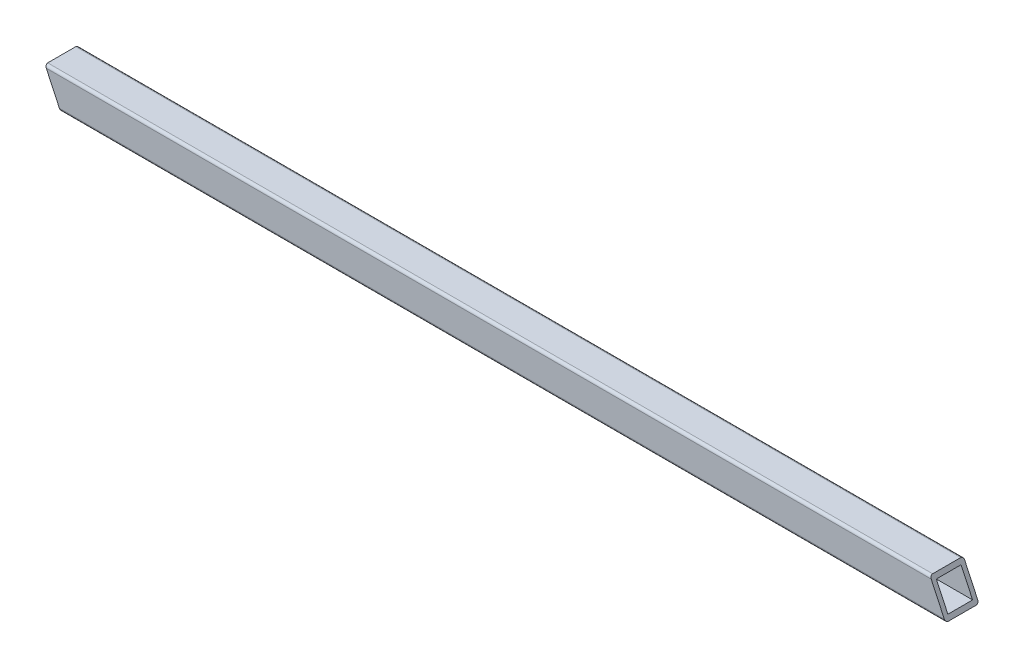
ISO-10303-21;
HEADER;
FILE_DESCRIPTION(('STEP AP214'),'2;1');
FILE_NAME('part.step','',(''),(''),'','','');
FILE_SCHEMA(('AUTOMOTIVE_DESIGN { 1 0 10303 214 1 1 1 1 }'));
ENDSEC;
DATA;
#1=APPLICATION_CONTEXT('core data for automotive mechanical design processes');
#2=APPLICATION_PROTOCOL_DEFINITION('international standard','automotive_design',2000,#1);
#3=PRODUCT_CONTEXT('',#1,'mechanical');
#4=PRODUCT('Part','Part','',(#3));
#5=PRODUCT_RELATED_PRODUCT_CATEGORY('part','',(#4));
#6=PRODUCT_DEFINITION_FORMATION('','',#4);
#7=PRODUCT_DEFINITION_CONTEXT('part definition',#1,'design');
#8=PRODUCT_DEFINITION('design','',#6,#7);
#9=PRODUCT_DEFINITION_SHAPE('','',#8);
#10=(LENGTH_UNIT() NAMED_UNIT(*) SI_UNIT(.MILLI.,.METRE.));
#11=(NAMED_UNIT(*) PLANE_ANGLE_UNIT() SI_UNIT($,.RADIAN.));
#12=(NAMED_UNIT(*) SI_UNIT($,.STERADIAN.) SOLID_ANGLE_UNIT());
#13=UNCERTAINTY_MEASURE_WITH_UNIT(LENGTH_MEASURE(1.E-05),#10,'distance_accuracy_value','');
#14=(GEOMETRIC_REPRESENTATION_CONTEXT(3) GLOBAL_UNCERTAINTY_ASSIGNED_CONTEXT((#13)) GLOBAL_UNIT_ASSIGNED_CONTEXT((#10,
#11,#12)) REPRESENTATION_CONTEXT('',''));
#15=CARTESIAN_POINT('',(0.,0.,0.));
#16=DIRECTION('',(0.,0.,1.));
#17=DIRECTION('',(1.,0.,0.));
#18=AXIS2_PLACEMENT_3D('',#15,#16,#17);
#19=CARTESIAN_POINT('',(342.2287417603,20.574,20.574));
#20=DIRECTION('',(0.,0.,-1.));
#21=DIRECTION('',(0.,1.,0.));
#22=AXIS2_PLACEMENT_3D('',#19,#20,#21);
#23=PLANE('',#22);
#24=DIRECTION('',(0.422618261740695,-0.906307787036652,0.));
#25=VECTOR('',#24,1.);
#26=CARTESIAN_POINT('',(61.7565431268757,-110.212334122334,20.574));
#27=LINE('',#26,#25);
#28=CARTESIAN_POINT('',(0.76987394361391,20.574,20.574));
#29=VERTEX_POINT('',#28);
#30=CARTESIAN_POINT('',(5.15223331495448,11.176,20.574));
#31=VERTEX_POINT('',#30);
#32=EDGE_CURVE('E11',#29,#31,#27,.T.);
#33=ORIENTED_EDGE('',*,*,#32,.F.);
#34=DIRECTION('',(-1.,0.,0.));
#35=VECTOR('',#34,1.);
#36=CARTESIAN_POINT('',(342.2287417603,20.574,20.574));
#37=LINE('',#36,#35);
#38=CARTESIAN_POINT('',(337.076508445345,20.574,20.574));
#39=VERTEX_POINT('',#38);
#40=EDGE_CURVE('E179',#39,#29,#37,.T.);
#41=ORIENTED_EDGE('',*,*,#40,.F.);
#42=DIRECTION('',(-0.422618261740695,0.906307787036652,0.));
#43=VECTOR('',#42,1.);
#44=CARTESIAN_POINT('',(337.996729234289,18.6005801497133,20.574));
#45=LINE('',#44,#43);
#46=CARTESIAN_POINT('',(341.458867816686,11.176,20.574));
#47=VERTEX_POINT('',#46);
#48=EDGE_CURVE('E50',#47,#39,#45,.T.);
#49=ORIENTED_EDGE('',*,*,#48,.F.);
#50=DIRECTION('',(-1.,0.,0.));
#51=VECTOR('',#50,1.);
#52=CARTESIAN_POINT('',(342.2287417603,11.176,20.574));
#53=LINE('',#52,#51);
#54=EDGE_CURVE('E176',#47,#31,#53,.T.);
#55=ORIENTED_EDGE('',*,*,#54,.T.);
#56=EDGE_LOOP('',(#33,#41,#49,#55));
#57=FACE_BOUND('',#56,.T.);
#58=ADVANCED_FACE('F43',(#57),#23,.T.);
#59=CARTESIAN_POINT('',(342.2287417603,20.574,11.176));
#60=DIRECTION('',(0.,-1.,0.));
#61=DIRECTION('',(0.,0.,-1.));
#62=AXIS2_PLACEMENT_3D('',#59,#60,#61);
#63=PLANE('',#62);
#64=DIRECTION('',(0.,0.,1.));
#65=VECTOR('',#64,1.);
#66=CARTESIAN_POINT('',(0.769873943613941,20.574,11.176));
#67=LINE('',#66,#65);
#68=CARTESIAN_POINT('',(0.769873943613941,20.574,11.176));
#69=VERTEX_POINT('',#68);
#70=EDGE_CURVE('E146',#69,#29,#67,.T.);
#71=ORIENTED_EDGE('',*,*,#70,.F.);
#72=DIRECTION('',(-1.,0.,0.));
#73=VECTOR('',#72,1.);
#74=CARTESIAN_POINT('',(342.2287417603,20.574,11.176));
#75=LINE('',#74,#73);
#76=CARTESIAN_POINT('',(337.076508445345,20.574,11.176));
#77=VERTEX_POINT('',#76);
#78=EDGE_CURVE('E182',#77,#69,#75,.T.);
#79=ORIENTED_EDGE('',*,*,#78,.F.);
#80=DIRECTION('',(0.,0.,-1.));
#81=VECTOR('',#80,1.);
#82=CARTESIAN_POINT('',(337.076508445345,20.574,11.176));
#83=LINE('',#82,#81);
#84=EDGE_CURVE('E228',#39,#77,#83,.T.);
#85=ORIENTED_EDGE('',*,*,#84,.F.);
#86=ORIENTED_EDGE('',*,*,#40,.T.);
#87=EDGE_LOOP('',(#71,#79,#85,#86));
#88=FACE_BOUND('',#87,.T.);
#89=ADVANCED_FACE('F252',(#88),#63,.T.);
#90=CARTESIAN_POINT('',(342.2287417603,11.176,11.176));
#91=DIRECTION('',(0.,0.,1.));
#92=DIRECTION('',(1.,0.,0.));
#93=AXIS2_PLACEMENT_3D('',#90,#91,#92);
#94=PLANE('',#93);
#95=DIRECTION('',(-0.422618261740695,0.906307787036652,0.));
#96=VECTOR('',#95,1.);
#97=CARTESIAN_POINT('',(65.3561859650917,-117.931793100251,11.176));
#98=LINE('',#97,#96);
#99=CARTESIAN_POINT('',(5.15223331495444,11.176,11.176));
#100=VERTEX_POINT('',#99);
#101=EDGE_CURVE('E207',#100,#69,#98,.T.);
#102=ORIENTED_EDGE('',*,*,#101,.F.);
#103=DIRECTION('',(-1.,0.,0.));
#104=VECTOR('',#103,1.);
#105=CARTESIAN_POINT('',(342.2287417603,11.176,11.176));
#106=LINE('',#105,#104);
#107=CARTESIAN_POINT('',(341.458867816686,11.176,11.176));
#108=VERTEX_POINT('',#107);
#109=EDGE_CURVE('E161',#108,#100,#106,.T.);
#110=ORIENTED_EDGE('',*,*,#109,.F.);
#111=DIRECTION('',(0.422618261740695,-0.906307787036652,0.));
#112=VECTOR('',#111,1.);
#113=CARTESIAN_POINT('',(341.596372072505,10.8811211717962,11.176));
#114=LINE('',#113,#112);
#115=EDGE_CURVE('E230',#77,#108,#114,.T.);
#116=ORIENTED_EDGE('',*,*,#115,.F.);
#117=ORIENTED_EDGE('',*,*,#78,.T.);
#118=EDGE_LOOP('',(#102,#110,#116,#117));
#119=FACE_BOUND('',#118,.T.);
#120=ADVANCED_FACE('F257',(#119),#94,.T.);
#121=CARTESIAN_POINT('',(342.2287417603,11.176,20.574));
#122=DIRECTION('',(0.,1.,0.));
#123=DIRECTION('',(0.,0.,1.));
#124=AXIS2_PLACEMENT_3D('',#121,#122,#123);
#125=PLANE('',#124);
#126=DIRECTION('',(0.,0.,-1.));
#127=VECTOR('',#126,1.);
#128=CARTESIAN_POINT('',(5.15223331495451,11.176,20.574));
#129=LINE('',#128,#127);
#130=EDGE_CURVE('E209',#31,#100,#129,.T.);
#131=ORIENTED_EDGE('',*,*,#130,.F.);
#132=ORIENTED_EDGE('',*,*,#54,.F.);
#133=DIRECTION('',(0.,0.,1.));
#134=VECTOR('',#133,1.);
#135=CARTESIAN_POINT('',(341.458867816686,11.176,20.574));
#136=LINE('',#135,#134);
#137=EDGE_CURVE('E232',#108,#47,#136,.T.);
#138=ORIENTED_EDGE('',*,*,#137,.F.);
#139=ORIENTED_EDGE('',*,*,#109,.T.);
#140=EDGE_LOOP('',(#131,#132,#138,#139));
#141=FACE_BOUND('',#140,.T.);
#142=ADVANCED_FACE('F272',(#141),#125,.T.);
#143=CARTESIAN_POINT('',(342.2287417603,9.525,9.525));
#144=DIRECTION('',(-0.906307787036652,-0.422618261740695,0.));
#145=DIRECTION('',(0.422618261740695,-0.906307787036652,0.));
#146=AXIS2_PLACEMENT_3D('',#143,#144,#145);
#147=PLANE('',#146);
#148=ORIENTED_EDGE('',*,*,#137,.T.);
#149=ORIENTED_EDGE('',*,*,#48,.T.);
#150=ORIENTED_EDGE('',*,*,#84,.T.);
#151=ORIENTED_EDGE('',*,*,#115,.T.);
#152=EDGE_LOOP('',(#148,#149,#150,#151));
#153=FACE_BOUND('',#152,.T.);
#154=DIRECTION('',(0.,0.,-1.));
#155=VECTOR('',#154,1.);
#156=CARTESIAN_POINT('',(342.2287417603,9.525,21.209));
#157=LINE('',#156,#155);
#158=CARTESIAN_POINT('',(342.2287417603,9.525,21.209));
#159=VERTEX_POINT('',#158);
#160=CARTESIAN_POINT('',(342.2287417603,9.525,10.541));
#161=VERTEX_POINT('',#160);
#162=EDGE_CURVE('E151',#159,#161,#157,.T.);
#163=ORIENTED_EDGE('',*,*,#162,.T.);
#164=CARTESIAN_POINT('',(341.754973179615,10.541,10.541));
#165=DIRECTION('',(-0.906307787036652,-0.422618261740695,0.));
#166=DIRECTION('',(-0.422618261740695,0.906307787036652,0.));
#167=AXIS2_PLACEMENT_3D('',#164,#165,#166);
#168=ELLIPSE('',#167,1.12103196566589,1.016);
#169=CARTESIAN_POINT('',(341.754973179615,10.541,9.525));
#170=VERTEX_POINT('',#169);
#171=EDGE_CURVE('E147',#170,#161,#168,.T.);
#172=ORIENTED_EDGE('',*,*,#171,.F.);
#173=DIRECTION('',(0.422618261740695,-0.906307787036652,0.));
#174=VECTOR('',#173,1.);
#175=CARTESIAN_POINT('',(342.2287417603,9.525,9.525));
#176=LINE('',#175,#174);
#177=CARTESIAN_POINT('',(336.780403082417,21.209,9.525));
#178=VERTEX_POINT('',#177);
#179=EDGE_CURVE('E137',#178,#170,#176,.T.);
#180=ORIENTED_EDGE('',*,*,#179,.F.);
#181=CARTESIAN_POINT('',(336.780403082417,21.209,10.541));
#182=DIRECTION('',(-0.906307787036652,-0.422618261740695,0.));
#183=DIRECTION('',(-0.422618261740695,0.906307787036652,0.));
#184=AXIS2_PLACEMENT_3D('',#181,#182,#183);
#185=ELLIPSE('',#184,1.12103196566589,1.016);
#186=CARTESIAN_POINT('',(336.306634501732,22.225,10.541));
#187=VERTEX_POINT('',#186);
#188=EDGE_CURVE('E200',#187,#178,#185,.T.);
#189=ORIENTED_EDGE('',*,*,#188,.F.);
#190=DIRECTION('',(0.,0.,1.));
#191=VECTOR('',#190,1.);
#192=CARTESIAN_POINT('',(336.306634501732,22.225,9.525));
#193=LINE('',#192,#191);
#194=CARTESIAN_POINT('',(336.306634501732,22.225,21.209));
#195=VERTEX_POINT('',#194);
#196=EDGE_CURVE('E224',#187,#195,#193,.T.);
#197=ORIENTED_EDGE('',*,*,#196,.T.);
#198=CARTESIAN_POINT('',(336.780403082417,21.209,21.209));
#199=DIRECTION('',(-0.906307787036652,-0.422618261740695,0.));
#200=DIRECTION('',(-0.422618261740695,0.906307787036652,0.));
#201=AXIS2_PLACEMENT_3D('',#198,#199,#200);
#202=ELLIPSE('',#201,1.12103196566589,1.016);
#203=CARTESIAN_POINT('',(336.780403082417,21.209,22.225));
#204=VERTEX_POINT('',#203);
#205=EDGE_CURVE('E57',#204,#195,#202,.T.);
#206=ORIENTED_EDGE('',*,*,#205,.F.);
#207=DIRECTION('',(0.422618261740695,-0.906307787036652,0.));
#208=VECTOR('',#207,1.);
#209=CARTESIAN_POINT('',(342.2287417603,9.525,22.225));
#210=LINE('',#209,#208);
#211=CARTESIAN_POINT('',(341.754973179615,10.541,22.225));
#212=VERTEX_POINT('',#211);
#213=EDGE_CURVE('E127',#204,#212,#210,.T.);
#214=ORIENTED_EDGE('',*,*,#213,.T.);
#215=CARTESIAN_POINT('',(341.754973179615,10.541,21.209));
#216=DIRECTION('',(-0.906307787036652,-0.422618261740695,0.));
#217=DIRECTION('',(-0.422618261740695,0.906307787036652,0.));
#218=AXIS2_PLACEMENT_3D('',#215,#216,#217);
#219=ELLIPSE('',#218,1.12103196566589,1.016);
#220=EDGE_CURVE('E130',#159,#212,#219,.T.);
#221=ORIENTED_EDGE('',*,*,#220,.F.);
#222=EDGE_LOOP('',(#163,#172,#180,#189,#197,#206,#214,#221));
#223=FACE_BOUND('',#222,.T.);
#224=ADVANCED_FACE('F129',(#153,#223),#147,.F.);
#225=CARTESIAN_POINT('',(0.,22.225,9.525));
#226=DIRECTION('',(0.906307787036652,0.422618261740695,0.));
#227=DIRECTION('',(-0.422618261740695,0.906307787036652,0.));
#228=AXIS2_PLACEMENT_3D('',#225,#226,#227);
#229=PLANE('',#228);
#230=ORIENTED_EDGE('',*,*,#130,.T.);
#231=ORIENTED_EDGE('',*,*,#101,.T.);
#232=ORIENTED_EDGE('',*,*,#70,.T.);
#233=ORIENTED_EDGE('',*,*,#32,.T.);
#234=EDGE_LOOP('',(#230,#231,#232,#233));
#235=FACE_BOUND('',#234,.T.);
#236=DIRECTION('',(-0.422618261740695,0.906307787036652,0.));
#237=VECTOR('',#236,1.);
#238=CARTESIAN_POINT('',(0.,22.225,22.225));
#239=LINE('',#238,#237);
#240=CARTESIAN_POINT('',(5.44833867788295,10.541,22.225));
#241=VERTEX_POINT('',#240);
#242=CARTESIAN_POINT('',(0.473768580685474,21.209,22.225));
#243=VERTEX_POINT('',#242);
#244=EDGE_CURVE('E136',#241,#243,#239,.T.);
#245=ORIENTED_EDGE('',*,*,#244,.T.);
#246=CARTESIAN_POINT('',(0.473768580685485,21.209,21.209));
#247=DIRECTION('',(0.906307787036652,0.422618261740695,0.));
#248=DIRECTION('',(-0.422618261740695,0.906307787036652,0.));
#249=AXIS2_PLACEMENT_3D('',#246,#247,#248);
#250=ELLIPSE('',#249,1.12103196566589,1.016);
#251=CARTESIAN_POINT('',(0.,22.225,21.209));
#252=VERTEX_POINT('',#251);
#253=EDGE_CURVE('E211',#252,#243,#250,.T.);
#254=ORIENTED_EDGE('',*,*,#253,.F.);
#255=DIRECTION('',(0.,0.,1.));
#256=VECTOR('',#255,1.);
#257=CARTESIAN_POINT('',(0.,22.225,10.541));
#258=LINE('',#257,#256);
#259=CARTESIAN_POINT('',(0.,22.225,10.541));
#260=VERTEX_POINT('',#259);
#261=EDGE_CURVE('E155',#260,#252,#258,.T.);
#262=ORIENTED_EDGE('',*,*,#261,.F.);
#263=CARTESIAN_POINT('',(0.473768580685485,21.209,10.541));
#264=DIRECTION('',(0.906307787036652,0.422618261740695,0.));
#265=DIRECTION('',(-0.422618261740695,0.906307787036652,0.));
#266=AXIS2_PLACEMENT_3D('',#263,#264,#265);
#267=ELLIPSE('',#266,1.12103196566589,1.016);
#268=CARTESIAN_POINT('',(0.473768580685475,21.209,9.525));
#269=VERTEX_POINT('',#268);
#270=EDGE_CURVE('E214',#269,#260,#267,.T.);
#271=ORIENTED_EDGE('',*,*,#270,.F.);
#272=DIRECTION('',(-0.422618261740695,0.906307787036652,0.));
#273=VECTOR('',#272,1.);
#274=CARTESIAN_POINT('',(0.,22.225,9.525));
#275=LINE('',#274,#273);
#276=CARTESIAN_POINT('',(5.44833867788292,10.541,9.525));
#277=VERTEX_POINT('',#276);
#278=EDGE_CURVE('E223',#277,#269,#275,.T.);
#279=ORIENTED_EDGE('',*,*,#278,.F.);
#280=CARTESIAN_POINT('',(5.44833867788297,10.541,10.541));
#281=DIRECTION('',(0.906307787036652,0.422618261740695,0.));
#282=DIRECTION('',(-0.422618261740695,0.906307787036652,0.));
#283=AXIS2_PLACEMENT_3D('',#280,#281,#282);
#284=ELLIPSE('',#283,1.12103196566589,1.016);
#285=CARTESIAN_POINT('',(5.92210725856844,9.525,10.541));
#286=VERTEX_POINT('',#285);
#287=EDGE_CURVE('E217',#286,#277,#284,.T.);
#288=ORIENTED_EDGE('',*,*,#287,.F.);
#289=DIRECTION('',(0.,0.,1.));
#290=VECTOR('',#289,1.);
#291=CARTESIAN_POINT('',(5.9221072585684,9.525,9.525));
#292=LINE('',#291,#290);
#293=CARTESIAN_POINT('',(5.9221072585684,9.525,21.209));
#294=VERTEX_POINT('',#293);
#295=EDGE_CURVE('E193',#286,#294,#292,.T.);
#296=ORIENTED_EDGE('',*,*,#295,.T.);
#297=CARTESIAN_POINT('',(5.44833867788297,10.541,21.209));
#298=DIRECTION('',(0.906307787036652,0.422618261740695,0.));
#299=DIRECTION('',(-0.422618261740695,0.906307787036652,0.));
#300=AXIS2_PLACEMENT_3D('',#297,#298,#299);
#301=ELLIPSE('',#300,1.12103196566589,1.016);
#302=EDGE_CURVE('E65',#241,#294,#301,.T.);
#303=ORIENTED_EDGE('',*,*,#302,.F.);
#304=EDGE_LOOP('',(#245,#254,#262,#271,#279,#288,#296,#303));
#305=FACE_BOUND('',#304,.T.);
#306=ADVANCED_FACE('F240',(#235,#305),#229,.F.);
#307=CARTESIAN_POINT('',(342.2287417603,10.541,21.209));
#308=DIRECTION('',(-1.,0.,0.));
#309=DIRECTION('',(0.,0.,1.));
#310=AXIS2_PLACEMENT_3D('',#307,#308,#309);
#311=CYLINDRICAL_SURFACE('',#310,1.016);
#312=DIRECTION('',(-1.,0.,0.));
#313=VECTOR('',#312,1.);
#314=CARTESIAN_POINT('',(342.2287417603,10.541,22.225));
#315=LINE('',#314,#313);
#316=EDGE_CURVE('E143',#212,#241,#315,.T.);
#317=ORIENTED_EDGE('',*,*,#316,.T.);
#318=ORIENTED_EDGE('',*,*,#302,.T.);
#319=DIRECTION('',(-1.,0.,0.));
#320=VECTOR('',#319,1.);
#321=CARTESIAN_POINT('',(342.2287417603,9.525,21.209));
#322=LINE('',#321,#320);
#323=EDGE_CURVE('E145',#159,#294,#322,.T.);
#324=ORIENTED_EDGE('',*,*,#323,.F.);
#325=ORIENTED_EDGE('',*,*,#220,.T.);
#326=EDGE_LOOP('',(#317,#318,#324,#325));
#327=FACE_BOUND('',#326,.T.);
#328=ADVANCED_FACE('F142',(#327),#311,.T.);
#329=CARTESIAN_POINT('',(342.2287417603,9.525,21.209));
#330=DIRECTION('',(0.,1.,0.));
#331=DIRECTION('',(0.,0.,1.));
#332=AXIS2_PLACEMENT_3D('',#329,#330,#331);
#333=PLANE('',#332);
#334=ORIENTED_EDGE('',*,*,#323,.T.);
#335=ORIENTED_EDGE('',*,*,#295,.F.);
#336=DIRECTION('',(-1.,0.,0.));
#337=VECTOR('',#336,1.);
#338=CARTESIAN_POINT('',(342.2287417603,9.525,10.541));
#339=LINE('',#338,#337);
#340=EDGE_CURVE('E162',#161,#286,#339,.T.);
#341=ORIENTED_EDGE('',*,*,#340,.F.);
#342=ORIENTED_EDGE('',*,*,#162,.F.);
#343=EDGE_LOOP('',(#334,#335,#341,#342));
#344=FACE_BOUND('',#343,.T.);
#345=ADVANCED_FACE('F191',(#344),#333,.F.);
#346=CARTESIAN_POINT('',(342.2287417603,10.541,10.541));
#347=DIRECTION('',(-1.,0.,0.));
#348=DIRECTION('',(0.,0.,1.));
#349=AXIS2_PLACEMENT_3D('',#346,#347,#348);
#350=CYLINDRICAL_SURFACE('',#349,1.016);
#351=ORIENTED_EDGE('',*,*,#340,.T.);
#352=ORIENTED_EDGE('',*,*,#287,.T.);
#353=DIRECTION('',(-1.,0.,0.));
#354=VECTOR('',#353,1.);
#355=CARTESIAN_POINT('',(342.2287417603,10.541,9.525));
#356=LINE('',#355,#354);
#357=EDGE_CURVE('E165',#170,#277,#356,.T.);
#358=ORIENTED_EDGE('',*,*,#357,.F.);
#359=ORIENTED_EDGE('',*,*,#171,.T.);
#360=EDGE_LOOP('',(#351,#352,#358,#359));
#361=FACE_BOUND('',#360,.T.);
#362=ADVANCED_FACE('F198',(#361),#350,.T.);
#363=CARTESIAN_POINT('',(342.2287417603,10.541,9.525));
#364=DIRECTION('',(0.,0.,1.));
#365=DIRECTION('',(1.,0.,0.));
#366=AXIS2_PLACEMENT_3D('',#363,#364,#365);
#367=PLANE('',#366);
#368=ORIENTED_EDGE('',*,*,#357,.T.);
#369=ORIENTED_EDGE('',*,*,#278,.T.);
#370=DIRECTION('',(-1.,0.,0.));
#371=VECTOR('',#370,1.);
#372=CARTESIAN_POINT('',(342.2287417603,21.209,9.525));
#373=LINE('',#372,#371);
#374=EDGE_CURVE('E168',#178,#269,#373,.T.);
#375=ORIENTED_EDGE('',*,*,#374,.F.);
#376=ORIENTED_EDGE('',*,*,#179,.T.);
#377=EDGE_LOOP('',(#368,#369,#375,#376));
#378=FACE_BOUND('',#377,.T.);
#379=ADVANCED_FACE('F221',(#378),#367,.F.);
#380=CARTESIAN_POINT('',(342.2287417603,21.209,10.541));
#381=DIRECTION('',(-1.,0.,0.));
#382=DIRECTION('',(0.,0.,1.));
#383=AXIS2_PLACEMENT_3D('',#380,#381,#382);
#384=CYLINDRICAL_SURFACE('',#383,1.016);
#385=ORIENTED_EDGE('',*,*,#374,.T.);
#386=ORIENTED_EDGE('',*,*,#270,.T.);
#387=DIRECTION('',(-1.,0.,0.));
#388=VECTOR('',#387,1.);
#389=CARTESIAN_POINT('',(342.2287417603,22.225,10.541));
#390=LINE('',#389,#388);
#391=EDGE_CURVE('E171',#187,#260,#390,.T.);
#392=ORIENTED_EDGE('',*,*,#391,.F.);
#393=ORIENTED_EDGE('',*,*,#188,.T.);
#394=EDGE_LOOP('',(#385,#386,#392,#393));
#395=FACE_BOUND('',#394,.T.);
#396=ADVANCED_FACE('F242',(#395),#384,.T.);
#397=CARTESIAN_POINT('',(342.2287417603,22.225,10.541));
#398=DIRECTION('',(0.,-1.,0.));
#399=DIRECTION('',(0.,0.,-1.));
#400=AXIS2_PLACEMENT_3D('',#397,#398,#399);
#401=PLANE('',#400);
#402=DIRECTION('',(-1.,0.,0.));
#403=VECTOR('',#402,1.);
#404=CARTESIAN_POINT('',(342.2287417603,22.225,21.209));
#405=LINE('',#404,#403);
#406=EDGE_CURVE('E153',#195,#252,#405,.T.);
#407=ORIENTED_EDGE('',*,*,#406,.F.);
#408=ORIENTED_EDGE('',*,*,#196,.F.);
#409=ORIENTED_EDGE('',*,*,#391,.T.);
#410=ORIENTED_EDGE('',*,*,#261,.T.);
#411=EDGE_LOOP('',(#407,#408,#409,#410));
#412=FACE_BOUND('',#411,.T.);
#413=ADVANCED_FACE('F238',(#412),#401,.F.);
#414=CARTESIAN_POINT('',(342.2287417603,21.209,21.209));
#415=DIRECTION('',(-1.,0.,0.));
#416=DIRECTION('',(0.,0.,1.));
#417=AXIS2_PLACEMENT_3D('',#414,#415,#416);
#418=CYLINDRICAL_SURFACE('',#417,1.016);
#419=ORIENTED_EDGE('',*,*,#406,.T.);
#420=ORIENTED_EDGE('',*,*,#253,.T.);
#421=DIRECTION('',(-1.,0.,0.));
#422=VECTOR('',#421,1.);
#423=CARTESIAN_POINT('',(342.2287417603,21.209,22.225));
#424=LINE('',#423,#422);
#425=EDGE_CURVE('E150',#204,#243,#424,.T.);
#426=ORIENTED_EDGE('',*,*,#425,.F.);
#427=ORIENTED_EDGE('',*,*,#205,.T.);
#428=EDGE_LOOP('',(#419,#420,#426,#427));
#429=FACE_BOUND('',#428,.T.);
#430=ADVANCED_FACE('F235',(#429),#418,.T.);
#431=CARTESIAN_POINT('',(342.2287417603,21.209,22.225));
#432=DIRECTION('',(0.,0.,-1.));
#433=DIRECTION('',(0.,1.,0.));
#434=AXIS2_PLACEMENT_3D('',#431,#432,#433);
#435=PLANE('',#434);
#436=ORIENTED_EDGE('',*,*,#425,.T.);
#437=ORIENTED_EDGE('',*,*,#244,.F.);
#438=ORIENTED_EDGE('',*,*,#316,.F.);
#439=ORIENTED_EDGE('',*,*,#213,.F.);
#440=EDGE_LOOP('',(#436,#437,#438,#439));
#441=FACE_BOUND('',#440,.T.);
#442=ADVANCED_FACE('F149',(#441),#435,.F.);
#443=CLOSED_SHELL('',(#58,#89,#120,#142,#224,#306,#328,#345,#362,#379,#396,#413,#430,#442));
#444=MANIFOLD_SOLID_BREP('B2',#443);
#445=ADVANCED_BREP_SHAPE_REPRESENTATION('',(#18,#444),#14);
#446=SHAPE_DEFINITION_REPRESENTATION(#9,#445);
ENDSEC;
END-ISO-10303-21;
